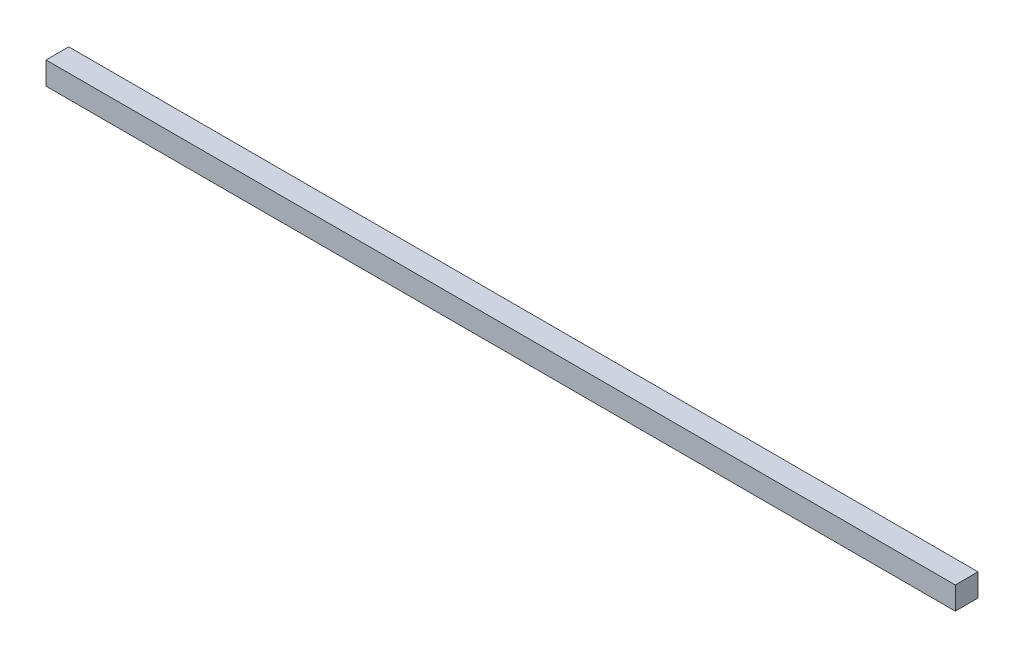
ISO-10303-21;
HEADER;
FILE_DESCRIPTION(('STEP AP214'),'2;1');
FILE_NAME('part.step','',(''),(''),'','','');
FILE_SCHEMA(('AUTOMOTIVE_DESIGN { 1 0 10303 214 1 1 1 1 }'));
ENDSEC;
DATA;
#1=APPLICATION_CONTEXT('core data for automotive mechanical design processes');
#2=APPLICATION_PROTOCOL_DEFINITION('international standard','automotive_design',2000,#1);
#3=PRODUCT_CONTEXT('',#1,'mechanical');
#4=PRODUCT('Part','Part','',(#3));
#5=PRODUCT_RELATED_PRODUCT_CATEGORY('part','',(#4));
#6=PRODUCT_DEFINITION_FORMATION('','',#4);
#7=PRODUCT_DEFINITION_CONTEXT('part definition',#1,'design');
#8=PRODUCT_DEFINITION('design','',#6,#7);
#9=PRODUCT_DEFINITION_SHAPE('','',#8);
#10=(LENGTH_UNIT() NAMED_UNIT(*) SI_UNIT(.MILLI.,.METRE.));
#11=(NAMED_UNIT(*) PLANE_ANGLE_UNIT() SI_UNIT($,.RADIAN.));
#12=(NAMED_UNIT(*) SI_UNIT($,.STERADIAN.) SOLID_ANGLE_UNIT());
#13=UNCERTAINTY_MEASURE_WITH_UNIT(LENGTH_MEASURE(1.E-05),#10,'distance_accuracy_value','');
#14=(GEOMETRIC_REPRESENTATION_CONTEXT(3) GLOBAL_UNCERTAINTY_ASSIGNED_CONTEXT((#13)) GLOBAL_UNIT_ASSIGNED_CONTEXT((#10,
#11,#12)) REPRESENTATION_CONTEXT('',''));
#15=CARTESIAN_POINT('',(0.,0.,0.));
#16=DIRECTION('',(0.,0.,1.));
#17=DIRECTION('',(1.,0.,0.));
#18=AXIS2_PLACEMENT_3D('',#15,#16,#17);
#19=CARTESIAN_POINT('',(889.,-22.225,22.225));
#20=DIRECTION('',(0.,-1.,0.));
#21=DIRECTION('',(0.,0.,-1.));
#22=AXIS2_PLACEMENT_3D('',#19,#20,#21);
#23=PLANE('',#22);
#24=DIRECTION('',(0.,0.,-1.));
#25=VECTOR('',#24,1.);
#26=CARTESIAN_POINT('',(-889.,-22.225,0.));
#27=LINE('',#26,#25);
#28=CARTESIAN_POINT('',(-889.,-22.225,22.225));
#29=VERTEX_POINT('',#28);
#30=CARTESIAN_POINT('',(-889.,-22.225,-22.225));
#31=VERTEX_POINT('',#30);
#32=EDGE_CURVE('E73',#29,#31,#27,.T.);
#33=ORIENTED_EDGE('',*,*,#32,.T.);
#34=DIRECTION('',(-1.,0.,0.));
#35=VECTOR('',#34,1.);
#36=CARTESIAN_POINT('',(889.,-22.225,-22.225));
#37=LINE('',#36,#35);
#38=CARTESIAN_POINT('',(889.,-22.225,-22.225));
#39=VERTEX_POINT('',#38);
#40=EDGE_CURVE('E85',#39,#31,#37,.T.);
#41=ORIENTED_EDGE('',*,*,#40,.F.);
#42=DIRECTION('',(0.,0.,-1.));
#43=VECTOR('',#42,1.);
#44=CARTESIAN_POINT('',(889.,-22.225,0.));
#45=LINE('',#44,#43);
#46=CARTESIAN_POINT('',(889.,-22.225,22.225));
#47=VERTEX_POINT('',#46);
#48=EDGE_CURVE('E38',#47,#39,#45,.T.);
#49=ORIENTED_EDGE('',*,*,#48,.F.);
#50=DIRECTION('',(1.,0.,0.));
#51=VECTOR('',#50,1.);
#52=CARTESIAN_POINT('',(889.,-22.225,22.225));
#53=LINE('',#52,#51);
#54=EDGE_CURVE('E99',#29,#47,#53,.T.);
#55=ORIENTED_EDGE('',*,*,#54,.F.);
#56=EDGE_LOOP('',(#33,#41,#49,#55));
#57=FACE_BOUND('',#56,.T.);
#58=ADVANCED_FACE('F35',(#57),#23,.T.);
#59=CARTESIAN_POINT('',(889.,0.,0.));
#60=DIRECTION('',(1.,0.,0.));
#61=DIRECTION('',(0.,0.,-1.));
#62=AXIS2_PLACEMENT_3D('',#59,#60,#61);
#63=PLANE('',#62);
#64=ORIENTED_EDGE('',*,*,#48,.T.);
#65=DIRECTION('',(0.,1.,0.));
#66=VECTOR('',#65,1.);
#67=CARTESIAN_POINT('',(889.,-22.225,-22.225));
#68=LINE('',#67,#66);
#69=CARTESIAN_POINT('',(889.,22.225,-22.225));
#70=VERTEX_POINT('',#69);
#71=EDGE_CURVE('E80',#70,#39,#68,.F.);
#72=ORIENTED_EDGE('',*,*,#71,.F.);
#73=DIRECTION('',(0.,0.,1.));
#74=VECTOR('',#73,1.);
#75=CARTESIAN_POINT('',(889.,22.225,-22.225));
#76=LINE('',#75,#74);
#77=CARTESIAN_POINT('',(889.,22.225,22.225));
#78=VERTEX_POINT('',#77);
#79=EDGE_CURVE('E101',#78,#70,#76,.F.);
#80=ORIENTED_EDGE('',*,*,#79,.F.);
#81=DIRECTION('',(0.,1.,0.));
#82=VECTOR('',#81,1.);
#83=CARTESIAN_POINT('',(889.,22.225,22.225));
#84=LINE('',#83,#82);
#85=EDGE_CURVE('E83',#47,#78,#84,.T.);
#86=ORIENTED_EDGE('',*,*,#85,.F.);
#87=EDGE_LOOP('',(#64,#72,#80,#86));
#88=FACE_BOUND('',#87,.T.);
#89=ADVANCED_FACE('F78',(#88),#63,.T.);
#90=CARTESIAN_POINT('',(889.,-22.225,-22.225));
#91=DIRECTION('',(0.,0.,-1.));
#92=DIRECTION('',(-1.,0.,0.));
#93=AXIS2_PLACEMENT_3D('',#90,#91,#92);
#94=PLANE('',#93);
#95=DIRECTION('',(0.,1.,0.));
#96=VECTOR('',#95,1.);
#97=CARTESIAN_POINT('',(-889.,0.,-22.225));
#98=LINE('',#97,#96);
#99=CARTESIAN_POINT('',(-889.,22.225,-22.225));
#100=VERTEX_POINT('',#99);
#101=EDGE_CURVE('E95',#31,#100,#98,.T.);
#102=ORIENTED_EDGE('',*,*,#101,.T.);
#103=DIRECTION('',(1.,0.,0.));
#104=VECTOR('',#103,1.);
#105=CARTESIAN_POINT('',(889.,22.225,-22.225));
#106=LINE('',#105,#104);
#107=EDGE_CURVE('E91',#70,#100,#106,.F.);
#108=ORIENTED_EDGE('',*,*,#107,.F.);
#109=ORIENTED_EDGE('',*,*,#71,.T.);
#110=ORIENTED_EDGE('',*,*,#40,.T.);
#111=EDGE_LOOP('',(#102,#108,#109,#110));
#112=FACE_BOUND('',#111,.T.);
#113=ADVANCED_FACE('F89',(#112),#94,.T.);
#114=CARTESIAN_POINT('',(-889.,0.,0.));
#115=DIRECTION('',(1.,0.,0.));
#116=DIRECTION('',(0.,0.,-1.));
#117=AXIS2_PLACEMENT_3D('',#114,#115,#116);
#118=PLANE('',#117);
#119=ORIENTED_EDGE('',*,*,#101,.F.);
#120=ORIENTED_EDGE('',*,*,#32,.F.);
#121=DIRECTION('',(0.,1.,0.));
#122=VECTOR('',#121,1.);
#123=CARTESIAN_POINT('',(-889.,22.225,22.225));
#124=LINE('',#123,#122);
#125=CARTESIAN_POINT('',(-889.,22.225,22.225));
#126=VERTEX_POINT('',#125);
#127=EDGE_CURVE('E53',#126,#29,#124,.F.);
#128=ORIENTED_EDGE('',*,*,#127,.F.);
#129=DIRECTION('',(0.,0.,1.));
#130=VECTOR('',#129,1.);
#131=CARTESIAN_POINT('',(-889.,22.225,-22.225));
#132=LINE('',#131,#130);
#133=EDGE_CURVE('E44',#100,#126,#132,.T.);
#134=ORIENTED_EDGE('',*,*,#133,.F.);
#135=EDGE_LOOP('',(#119,#120,#128,#134));
#136=FACE_BOUND('',#135,.T.);
#137=ADVANCED_FACE('F107',(#136),#118,.F.);
#138=CARTESIAN_POINT('',(889.,22.225,22.225));
#139=DIRECTION('',(0.,0.,1.));
#140=DIRECTION('',(1.,0.,0.));
#141=AXIS2_PLACEMENT_3D('',#138,#139,#140);
#142=PLANE('',#141);
#143=ORIENTED_EDGE('',*,*,#127,.T.);
#144=ORIENTED_EDGE('',*,*,#54,.T.);
#145=ORIENTED_EDGE('',*,*,#85,.T.);
#146=DIRECTION('',(1.,0.,0.));
#147=VECTOR('',#146,1.);
#148=CARTESIAN_POINT('',(889.,22.225,22.225));
#149=LINE('',#148,#147);
#150=EDGE_CURVE('E11',#126,#78,#149,.T.);
#151=ORIENTED_EDGE('',*,*,#150,.F.);
#152=EDGE_LOOP('',(#143,#144,#145,#151));
#153=FACE_BOUND('',#152,.T.);
#154=ADVANCED_FACE('F109',(#153),#142,.T.);
#155=CARTESIAN_POINT('',(889.,22.225,-22.225));
#156=DIRECTION('',(0.,1.,0.));
#157=DIRECTION('',(0.,0.,1.));
#158=AXIS2_PLACEMENT_3D('',#155,#156,#157);
#159=PLANE('',#158);
#160=ORIENTED_EDGE('',*,*,#133,.T.);
#161=ORIENTED_EDGE('',*,*,#150,.T.);
#162=ORIENTED_EDGE('',*,*,#79,.T.);
#163=ORIENTED_EDGE('',*,*,#107,.T.);
#164=EDGE_LOOP('',(#160,#161,#162,#163));
#165=FACE_BOUND('',#164,.T.);
#166=ADVANCED_FACE('F106',(#165),#159,.T.);
#167=CLOSED_SHELL('',(#58,#89,#113,#137,#154,#166));
#168=MANIFOLD_SOLID_BREP('B2',#167);
#169=ADVANCED_BREP_SHAPE_REPRESENTATION('',(#18,#168),#14);
#170=SHAPE_DEFINITION_REPRESENTATION(#9,#169);
ENDSEC;
END-ISO-10303-21;
